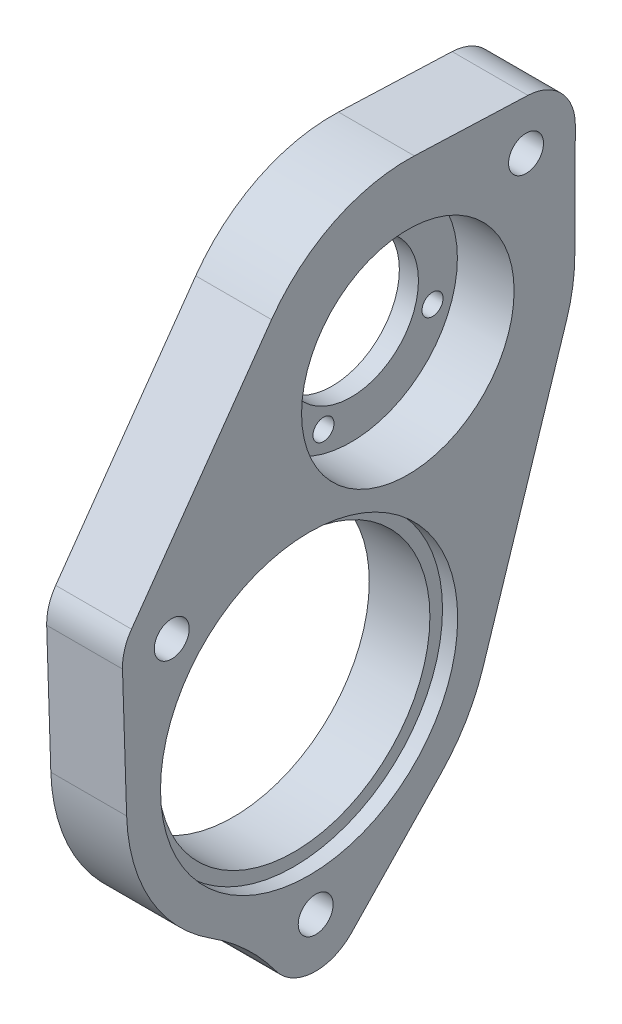
ISO-10303-21;
HEADER;
FILE_DESCRIPTION(('STEP AP214'),'2;1');
FILE_NAME('part.step','',(''),(''),'','','');
FILE_SCHEMA(('AUTOMOTIVE_DESIGN { 1 0 10303 214 1 1 1 1 }'));
ENDSEC;
DATA;
#1=APPLICATION_CONTEXT('core data for automotive mechanical design processes');
#2=APPLICATION_PROTOCOL_DEFINITION('international standard','automotive_design',2000,#1);
#3=PRODUCT_CONTEXT('',#1,'mechanical');
#4=PRODUCT('Part','Part','',(#3));
#5=PRODUCT_RELATED_PRODUCT_CATEGORY('part','',(#4));
#6=PRODUCT_DEFINITION_FORMATION('','',#4);
#7=PRODUCT_DEFINITION_CONTEXT('part definition',#1,'design');
#8=PRODUCT_DEFINITION('design','',#6,#7);
#9=PRODUCT_DEFINITION_SHAPE('','',#8);
#10=(LENGTH_UNIT() NAMED_UNIT(*) SI_UNIT(.MILLI.,.METRE.));
#11=(NAMED_UNIT(*) PLANE_ANGLE_UNIT() SI_UNIT($,.RADIAN.));
#12=(NAMED_UNIT(*) SI_UNIT($,.STERADIAN.) SOLID_ANGLE_UNIT());
#13=UNCERTAINTY_MEASURE_WITH_UNIT(LENGTH_MEASURE(1.E-05),#10,'distance_accuracy_value','');
#14=(GEOMETRIC_REPRESENTATION_CONTEXT(3) GLOBAL_UNCERTAINTY_ASSIGNED_CONTEXT((#13)) GLOBAL_UNIT_ASSIGNED_CONTEXT((#10,
#11,#12)) REPRESENTATION_CONTEXT('',''));
#15=CARTESIAN_POINT('',(0.,0.,0.));
#16=DIRECTION('',(0.,0.,1.));
#17=DIRECTION('',(1.,0.,0.));
#18=AXIS2_PLACEMENT_3D('',#15,#16,#17);
#19=CARTESIAN_POINT('',(-55.5625,36.576,-137.31419272294));
#20=DIRECTION('',(1.,0.,0.));
#21=DIRECTION('',(0.,0.,-1.));
#22=AXIS2_PLACEMENT_3D('',#19,#20,#21);
#23=CYLINDRICAL_SURFACE('',#22,14.2367);
#24=CARTESIAN_POINT('',(-55.5625,36.576,-137.31419272294));
#25=DIRECTION('',(-1.,0.,0.));
#26=DIRECTION('',(0.,0.,1.));
#27=AXIS2_PLACEMENT_3D('',#24,#25,#26);
#28=CIRCLE('',#27,14.2367);
#29=CARTESIAN_POINT('',(-55.5625,36.576,-123.07749272294));
#30=VERTEX_POINT('',#29);
#31=EDGE_CURVE('E207',#30,#30,#28,.T.);
#32=ORIENTED_EDGE('',*,*,#31,.T.);
#33=EDGE_LOOP('',(#32));
#34=FACE_BOUND('',#33,.T.);
#35=CARTESIAN_POINT('',(-49.2125,36.576,-137.31419272294));
#36=DIRECTION('',(1.,0.,0.));
#37=DIRECTION('',(0.,0.,-1.));
#38=AXIS2_PLACEMENT_3D('',#35,#36,#37);
#39=CIRCLE('',#38,14.2367);
#40=CARTESIAN_POINT('',(-49.2125,36.576,-151.55089272294));
#41=VERTEX_POINT('',#40);
#42=EDGE_CURVE('E48',#41,#41,#39,.T.);
#43=ORIENTED_EDGE('',*,*,#42,.T.);
#44=EDGE_LOOP('',(#43));
#45=FACE_BOUND('',#44,.T.);
#46=ADVANCED_FACE('F44',(#34,#45),#23,.F.);
#47=CARTESIAN_POINT('',(-55.5625,71.8176490521173,-150.54405970577));
#48=DIRECTION('',(1.,0.,0.));
#49=DIRECTION('',(0.,0.,-1.));
#50=AXIS2_PLACEMENT_3D('',#47,#48,#49);
#51=CYLINDRICAL_SURFACE('',#50,1.09999999999999);
#52=CARTESIAN_POINT('',(-55.5625,71.8176490521173,-150.54405970577));
#53=DIRECTION('',(-1.,0.,0.));
#54=DIRECTION('',(0.,0.,1.));
#55=AXIS2_PLACEMENT_3D('',#52,#53,#54);
#56=CIRCLE('',#55,1.09999999999999);
#57=CARTESIAN_POINT('',(-55.5625,71.8176490521173,-149.44405970577));
#58=VERTEX_POINT('',#57);
#59=EDGE_CURVE('E216',#58,#58,#56,.T.);
#60=ORIENTED_EDGE('',*,*,#59,.T.);
#61=EDGE_LOOP('',(#60));
#62=FACE_BOUND('',#61,.T.);
#63=CARTESIAN_POINT('',(-53.5625,71.8176490521173,-150.54405970577));
#64=DIRECTION('',(1.,0.,0.));
#65=DIRECTION('',(0.,0.,-1.));
#66=AXIS2_PLACEMENT_3D('',#63,#64,#65);
#67=CIRCLE('',#66,1.09999999999999);
#68=CARTESIAN_POINT('',(-53.5625,71.8176490521173,-151.64405970577));
#69=VERTEX_POINT('',#68);
#70=EDGE_CURVE('E180',#69,#69,#67,.T.);
#71=ORIENTED_EDGE('',*,*,#70,.T.);
#72=EDGE_LOOP('',(#71));
#73=FACE_BOUND('',#72,.T.);
#74=ADVANCED_FACE('F334',(#62,#73),#51,.F.);
#75=CARTESIAN_POINT('',(-55.5625,60.4028635691856,-156.174572327072));
#76=DIRECTION('',(1.,0.,0.));
#77=DIRECTION('',(0.,0.,-1.));
#78=AXIS2_PLACEMENT_3D('',#75,#76,#77);
#79=CYLINDRICAL_SURFACE('',#78,1.09999999999999);
#80=CARTESIAN_POINT('',(-55.5625,60.4028635691856,-156.174572327072));
#81=DIRECTION('',(-1.,0.,0.));
#82=DIRECTION('',(0.,0.,1.));
#83=AXIS2_PLACEMENT_3D('',#80,#81,#82);
#84=CIRCLE('',#83,1.09999999999999);
#85=CARTESIAN_POINT('',(-55.5625,60.4028635691856,-155.074572327072));
#86=VERTEX_POINT('',#85);
#87=EDGE_CURVE('E213',#86,#86,#84,.T.);
#88=ORIENTED_EDGE('',*,*,#87,.T.);
#89=EDGE_LOOP('',(#88));
#90=FACE_BOUND('',#89,.T.);
#91=CARTESIAN_POINT('',(-53.5625,60.4028635691856,-156.174572327072));
#92=DIRECTION('',(1.,0.,0.));
#93=DIRECTION('',(0.,0.,-1.));
#94=AXIS2_PLACEMENT_3D('',#91,#92,#93);
#95=CIRCLE('',#94,1.09999999999999);
#96=CARTESIAN_POINT('',(-53.5625,60.4028635691856,-157.274572327072));
#97=VERTEX_POINT('',#96);
#98=EDGE_CURVE('E327',#97,#97,#95,.T.);
#99=ORIENTED_EDGE('',*,*,#98,.T.);
#100=EDGE_LOOP('',(#99));
#101=FACE_BOUND('',#100,.T.);
#102=ADVANCED_FACE('F404',(#90,#101),#79,.F.);
#103=CARTESIAN_POINT('',(-55.5625,66.1871364308144,-139.129274222838));
#104=DIRECTION('',(1.,0.,0.));
#105=DIRECTION('',(0.,0.,-1.));
#106=AXIS2_PLACEMENT_3D('',#103,#104,#105);
#107=CYLINDRICAL_SURFACE('',#106,1.09999999999999);
#108=CARTESIAN_POINT('',(-55.5625,66.1871364308144,-139.129274222838));
#109=DIRECTION('',(-1.,0.,0.));
#110=DIRECTION('',(0.,0.,1.));
#111=AXIS2_PLACEMENT_3D('',#108,#109,#110);
#112=CIRCLE('',#111,1.09999999999999);
#113=CARTESIAN_POINT('',(-55.5625,66.1871364308144,-138.029274222838));
#114=VERTEX_POINT('',#113);
#115=EDGE_CURVE('E210',#114,#114,#112,.T.);
#116=ORIENTED_EDGE('',*,*,#115,.T.);
#117=EDGE_LOOP('',(#116));
#118=FACE_BOUND('',#117,.T.);
#119=CARTESIAN_POINT('',(-53.5625,66.1871364308144,-139.129274222838));
#120=DIRECTION('',(1.,0.,0.));
#121=DIRECTION('',(0.,0.,-1.));
#122=AXIS2_PLACEMENT_3D('',#119,#120,#121);
#123=CIRCLE('',#122,1.09999999999999);
#124=CARTESIAN_POINT('',(-53.5625,66.1871364308144,-140.229274222838));
#125=VERTEX_POINT('',#124);
#126=EDGE_CURVE('E325',#125,#125,#123,.T.);
#127=ORIENTED_EDGE('',*,*,#126,.T.);
#128=EDGE_LOOP('',(#127));
#129=FACE_BOUND('',#128,.T.);
#130=ADVANCED_FACE('F410',(#118,#129),#107,.F.);
#131=CARTESIAN_POINT('',(-55.5625,54.7723509478827,-144.759786844141));
#132=DIRECTION('',(1.,0.,0.));
#133=DIRECTION('',(0.,0.,-1.));
#134=AXIS2_PLACEMENT_3D('',#131,#132,#133);
#135=CYLINDRICAL_SURFACE('',#134,1.09999999999999);
#136=CARTESIAN_POINT('',(-55.5625,54.7723509478827,-144.759786844141));
#137=DIRECTION('',(-1.,0.,0.));
#138=DIRECTION('',(0.,0.,1.));
#139=AXIS2_PLACEMENT_3D('',#136,#137,#138);
#140=CIRCLE('',#139,1.09999999999999);
#141=CARTESIAN_POINT('',(-55.5625,54.7723509478827,-143.659786844141));
#142=VERTEX_POINT('',#141);
#143=EDGE_CURVE('E204',#142,#142,#140,.T.);
#144=ORIENTED_EDGE('',*,*,#143,.T.);
#145=EDGE_LOOP('',(#144));
#146=FACE_BOUND('',#145,.T.);
#147=CARTESIAN_POINT('',(-53.5625,54.7723509478827,-144.759786844141));
#148=DIRECTION('',(1.,0.,0.));
#149=DIRECTION('',(0.,0.,-1.));
#150=AXIS2_PLACEMENT_3D('',#147,#148,#149);
#151=CIRCLE('',#150,1.09999999999999);
#152=CARTESIAN_POINT('',(-53.5625,54.7723509478827,-145.859786844141));
#153=VERTEX_POINT('',#152);
#154=EDGE_CURVE('E278',#153,#153,#151,.T.);
#155=ORIENTED_EDGE('',*,*,#154,.T.);
#156=EDGE_LOOP('',(#155));
#157=FACE_BOUND('',#156,.T.);
#158=ADVANCED_FACE('F412',(#146,#157),#135,.F.);
#159=CARTESIAN_POINT('',(-55.5625,63.295,-147.651923274955));
#160=DIRECTION('',(1.,0.,0.));
#161=DIRECTION('',(0.,0.,-1.));
#162=AXIS2_PLACEMENT_3D('',#159,#160,#161);
#163=CYLINDRICAL_SURFACE('',#162,7.05000000000001);
#164=CARTESIAN_POINT('',(-55.5625,63.295,-147.651923274955));
#165=DIRECTION('',(-1.,0.,0.));
#166=DIRECTION('',(0.,0.,1.));
#167=AXIS2_PLACEMENT_3D('',#164,#165,#166);
#168=CIRCLE('',#167,7.05000000000001);
#169=CARTESIAN_POINT('',(-55.5625,63.295,-140.601923274955));
#170=VERTEX_POINT('',#169);
#171=EDGE_CURVE('E219',#170,#170,#168,.T.);
#172=ORIENTED_EDGE('',*,*,#171,.T.);
#173=EDGE_LOOP('',(#172));
#174=FACE_BOUND('',#173,.T.);
#175=CARTESIAN_POINT('',(-53.5625,63.295,-147.651923274955));
#176=DIRECTION('',(1.,0.,0.));
#177=DIRECTION('',(0.,0.,-1.));
#178=AXIS2_PLACEMENT_3D('',#175,#176,#177);
#179=CIRCLE('',#178,7.05000000000001);
#180=CARTESIAN_POINT('',(-53.5625,63.295,-154.701923274955));
#181=VERTEX_POINT('',#180);
#182=EDGE_CURVE('E275',#181,#181,#179,.T.);
#183=ORIENTED_EDGE('',*,*,#182,.T.);
#184=EDGE_LOOP('',(#183));
#185=FACE_BOUND('',#184,.T.);
#186=ADVANCED_FACE('F415',(#174,#185),#163,.F.);
#187=CARTESIAN_POINT('',(-55.5625,86.401817609715,-3.36327832071318));
#188=DIRECTION('',(0.,0.99924324262576,-0.0388965559755132));
#189=DIRECTION('',(0.,0.0388965559755132,0.99924324262576));
#190=AXIS2_PLACEMENT_3D('',#187,#188,#189);
#191=PLANE('',#190);
#192=DIRECTION('',(0.,0.0388965559755132,0.99924324262576));
#193=VECTOR('',#192,1.);
#194=CARTESIAN_POINT('',(-47.625,86.401817609715,-3.36327832071318));
#195=LINE('',#194,#193);
#196=CARTESIAN_POINT('',(-47.625,80.2956551243813,-160.229135690856));
#197=VERTEX_POINT('',#196);
#198=CARTESIAN_POINT('',(-47.625,80.7587741513704,-148.331718383739));
#199=VERTEX_POINT('',#198);
#200=EDGE_CURVE('E153',#197,#199,#195,.T.);
#201=ORIENTED_EDGE('',*,*,#200,.F.);
#202=DIRECTION('',(1.,0.,0.));
#203=VECTOR('',#202,1.);
#204=CARTESIAN_POINT('',(-55.5625,80.2956551243813,-160.229135690856));
#205=LINE('',#204,#203);
#206=CARTESIAN_POINT('',(-55.5625,80.2956551243813,-160.229135690856));
#207=VERTEX_POINT('',#206);
#208=EDGE_CURVE('E147',#207,#197,#205,.T.);
#209=ORIENTED_EDGE('',*,*,#208,.F.);
#210=DIRECTION('',(0.,0.0388965559755132,0.99924324262576));
#211=VECTOR('',#210,1.);
#212=CARTESIAN_POINT('',(-55.5625,86.401817609715,-3.36327832071318));
#213=LINE('',#212,#211);
#214=CARTESIAN_POINT('',(-55.5625,80.7587741513704,-148.331718383739));
#215=VERTEX_POINT('',#214);
#216=EDGE_CURVE('E151',#207,#215,#213,.T.);
#217=ORIENTED_EDGE('',*,*,#216,.T.);
#218=DIRECTION('',(1.,0.,0.));
#219=VECTOR('',#218,1.);
#220=CARTESIAN_POINT('',(-55.5625,80.7587741513704,-148.331718383739));
#221=LINE('',#220,#219);
#222=EDGE_CURVE('E222',#215,#199,#221,.T.);
#223=ORIENTED_EDGE('',*,*,#222,.T.);
#224=EDGE_LOOP('',(#201,#209,#217,#223));
#225=FACE_BOUND('',#224,.T.);
#226=ADVANCED_FACE('F149',(#225),#191,.T.);
#227=CARTESIAN_POINT('',(-55.5625,75.1395499999999,-160.028429073056));
#228=DIRECTION('',(1.,0.,0.));
#229=DIRECTION('',(0.,0.,-1.));
#230=AXIS2_PLACEMENT_3D('',#227,#228,#229);
#231=CYLINDRICAL_SURFACE('',#230,5.16000999999998);
#232=CARTESIAN_POINT('',(-47.625,75.1395499999999,-160.028429073056));
#233=DIRECTION('',(-1.,0.,0.));
#234=DIRECTION('',(0.,0.,1.));
#235=AXIS2_PLACEMENT_3D('',#232,#233,#234);
#236=CIRCLE('',#235,5.16000999999998);
#237=CARTESIAN_POINT('',(-47.625,75.1136899962217,-165.188374272407));
#238=VERTEX_POINT('',#237);
#239=EDGE_CURVE('E224',#197,#238,#236,.T.);
#240=ORIENTED_EDGE('',*,*,#239,.T.);
#241=DIRECTION('',(1.,0.,0.));
#242=VECTOR('',#241,1.);
#243=CARTESIAN_POINT('',(-55.5625,75.1136899962217,-165.188374272407));
#244=LINE('',#243,#242);
#245=CARTESIAN_POINT('',(-55.5625,75.1136899962217,-165.188374272407));
#246=VERTEX_POINT('',#245);
#247=EDGE_CURVE('E157',#246,#238,#244,.T.);
#248=ORIENTED_EDGE('',*,*,#247,.F.);
#249=CARTESIAN_POINT('',(-55.5625,75.1395499999999,-160.028429073056));
#250=DIRECTION('',(-1.,0.,0.));
#251=DIRECTION('',(0.,0.,1.));
#252=AXIS2_PLACEMENT_3D('',#249,#250,#251);
#253=CIRCLE('',#252,5.16000999999998);
#254=EDGE_CURVE('E160',#207,#246,#253,.T.);
#255=ORIENTED_EDGE('',*,*,#254,.F.);
#256=ORIENTED_EDGE('',*,*,#208,.T.);
#257=EDGE_LOOP('',(#240,#248,#255,#256));
#258=FACE_BOUND('',#257,.T.);
#259=ADVANCED_FACE('F161',(#258),#231,.T.);
#260=CARTESIAN_POINT('',(-55.5625,-0.825964206707811,-164.80778888463));
#261=DIRECTION('',(0.,0.00501161892675137,0.999987441759012));
#262=DIRECTION('',(0.,-0.999987441759012,0.00501161892675137));
#263=AXIS2_PLACEMENT_3D('',#260,#261,#262);
#264=PLANE('',#263);
#265=DIRECTION('',(0.,-0.999987441759012,0.00501161892675137));
#266=VECTOR('',#265,1.);
#267=CARTESIAN_POINT('',(-47.625,-0.825964206707811,-164.80778888463));
#268=LINE('',#267,#266);
#269=CARTESIAN_POINT('',(-47.625,63.2074119360171,-165.128703794577));
#270=VERTEX_POINT('',#269);
#271=EDGE_CURVE('E226',#238,#270,#268,.T.);
#272=ORIENTED_EDGE('',*,*,#271,.T.);
#273=DIRECTION('',(1.,0.,0.));
#274=VECTOR('',#273,1.);
#275=CARTESIAN_POINT('',(-55.5625,63.2074119360171,-165.128703794577));
#276=LINE('',#275,#274);
#277=CARTESIAN_POINT('',(-55.5625,63.2074119360171,-165.128703794577));
#278=VERTEX_POINT('',#277);
#279=EDGE_CURVE('E267',#278,#270,#276,.T.);
#280=ORIENTED_EDGE('',*,*,#279,.F.);
#281=DIRECTION('',(0.,-0.999987441759012,0.00501161892675137));
#282=VECTOR('',#281,1.);
#283=CARTESIAN_POINT('',(-55.5625,-0.825964206707811,-164.80778888463));
#284=LINE('',#283,#282);
#285=EDGE_CURVE('E165',#246,#278,#284,.T.);
#286=ORIENTED_EDGE('',*,*,#285,.F.);
#287=ORIENTED_EDGE('',*,*,#247,.T.);
#288=EDGE_LOOP('',(#272,#280,#286,#287));
#289=FACE_BOUND('',#288,.T.);
#290=ADVANCED_FACE('F365',(#289),#264,.F.);
#291=CARTESIAN_POINT('',(-55.5625,63.295,-147.651923274955));
#292=DIRECTION('',(1.,0.,0.));
#293=DIRECTION('',(0.,0.,-1.));
#294=AXIS2_PLACEMENT_3D('',#291,#292,#293);
#295=CYLINDRICAL_SURFACE('',#294,17.477);
#296=CARTESIAN_POINT('',(-47.625,63.295,-147.651923274955));
#297=DIRECTION('',(-1.,0.,0.));
#298=DIRECTION('',(0.,0.,1.));
#299=AXIS2_PLACEMENT_3D('',#296,#297,#298);
#300=CIRCLE('',#299,17.477);
#301=CARTESIAN_POINT('',(-47.625,57.9299776505254,-164.285084856255));
#302=VERTEX_POINT('',#301);
#303=EDGE_CURVE('E178',#270,#302,#300,.T.);
#304=ORIENTED_EDGE('',*,*,#303,.T.);
#305=DIRECTION('',(1.,0.,0.));
#306=VECTOR('',#305,1.);
#307=CARTESIAN_POINT('',(-55.5625,57.9299776505254,-164.285084856255));
#308=LINE('',#307,#306);
#309=CARTESIAN_POINT('',(-55.5625,57.9299776505254,-164.285084856255));
#310=VERTEX_POINT('',#309);
#311=EDGE_CURVE('E265',#310,#302,#308,.T.);
#312=ORIENTED_EDGE('',*,*,#311,.F.);
#313=CARTESIAN_POINT('',(-55.5625,63.295,-147.651923274955));
#314=DIRECTION('',(-1.,0.,0.));
#315=DIRECTION('',(0.,0.,1.));
#316=AXIS2_PLACEMENT_3D('',#313,#314,#315);
#317=CIRCLE('',#316,17.477);
#318=EDGE_CURVE('E184',#278,#310,#317,.T.);
#319=ORIENTED_EDGE('',*,*,#318,.F.);
#320=ORIENTED_EDGE('',*,*,#279,.T.);
#321=EDGE_LOOP('',(#304,#312,#319,#320));
#322=FACE_BOUND('',#321,.T.);
#323=ADVANCED_FACE('F371',(#322),#295,.T.);
#324=CARTESIAN_POINT('',(-55.5625,-42.5376311194463,-131.879281316467));
#325=DIRECTION('',(0.,-0.306976160066063,-0.951717204400075));
#326=DIRECTION('',(0.,0.951717204400075,-0.306976160066063));
#327=AXIS2_PLACEMENT_3D('',#324,#325,#326);
#328=PLANE('',#327);
#329=DIRECTION('',(0.,0.951717204400075,-0.306976160066063));
#330=VECTOR('',#329,1.);
#331=CARTESIAN_POINT('',(-47.625,-42.5376311194463,-131.879281316467));
#332=LINE('',#331,#330);
#333=CARTESIAN_POINT('',(-47.625,30.7086111645773,-155.504839509241));
#334=VERTEX_POINT('',#333);
#335=EDGE_CURVE('E229',#334,#302,#332,.T.);
#336=ORIENTED_EDGE('',*,*,#335,.F.);
#337=DIRECTION('',(1.,0.,0.));
#338=VECTOR('',#337,1.);
#339=CARTESIAN_POINT('',(-55.5625,30.7086111645773,-155.504839509241));
#340=LINE('',#339,#338);
#341=CARTESIAN_POINT('',(-55.5625,30.7086111645773,-155.504839509241));
#342=VERTEX_POINT('',#341);
#343=EDGE_CURVE('E263',#342,#334,#340,.T.);
#344=ORIENTED_EDGE('',*,*,#343,.F.);
#345=DIRECTION('',(0.,0.951717204400075,-0.306976160066063));
#346=VECTOR('',#345,1.);
#347=CARTESIAN_POINT('',(-55.5625,-42.5376311194463,-131.879281316467));
#348=LINE('',#347,#346);
#349=EDGE_CURVE('E186',#342,#310,#348,.T.);
#350=ORIENTED_EDGE('',*,*,#349,.T.);
#351=ORIENTED_EDGE('',*,*,#311,.T.);
#352=EDGE_LOOP('',(#336,#344,#350,#351));
#353=FACE_BOUND('',#352,.T.);
#354=ADVANCED_FACE('F374',(#353),#328,.T.);
#355=CARTESIAN_POINT('',(-55.5625,36.576,-137.31419272294));
#356=DIRECTION('',(1.,0.,0.));
#357=DIRECTION('',(0.,0.,-1.));
#358=AXIS2_PLACEMENT_3D('',#355,#356,#357);
#359=CYLINDRICAL_SURFACE('',#358,19.1135);
#360=CARTESIAN_POINT('',(-47.625,36.576,-137.31419272294));
#361=DIRECTION('',(-1.,0.,0.));
#362=DIRECTION('',(0.,0.,1.));
#363=AXIS2_PLACEMENT_3D('',#360,#361,#362);
#364=CIRCLE('',#363,19.1135);
#365=CARTESIAN_POINT('',(-47.625,23.343004735663,-151.105991684063));
#366=VERTEX_POINT('',#365);
#367=EDGE_CURVE('E232',#334,#366,#364,.T.);
#368=ORIENTED_EDGE('',*,*,#367,.T.);
#369=DIRECTION('',(1.,0.,0.));
#370=VECTOR('',#369,1.);
#371=CARTESIAN_POINT('',(-55.5625,23.343004735663,-151.105991684063));
#372=LINE('',#371,#370);
#373=CARTESIAN_POINT('',(-55.5625,23.343004735663,-151.105991684063));
#374=VERTEX_POINT('',#373);
#375=EDGE_CURVE('E260',#374,#366,#372,.T.);
#376=ORIENTED_EDGE('',*,*,#375,.F.);
#377=CARTESIAN_POINT('',(-55.5625,36.576,-137.31419272294));
#378=DIRECTION('',(-1.,0.,0.));
#379=DIRECTION('',(0.,0.,1.));
#380=AXIS2_PLACEMENT_3D('',#377,#378,#379);
#381=CIRCLE('',#380,19.1135);
#382=EDGE_CURVE('E189',#342,#374,#381,.T.);
#383=ORIENTED_EDGE('',*,*,#382,.F.);
#384=ORIENTED_EDGE('',*,*,#343,.T.);
#385=EDGE_LOOP('',(#368,#376,#383,#384));
#386=FACE_BOUND('',#385,.T.);
#387=ADVANCED_FACE('F379',(#386),#359,.T.);
#388=CARTESIAN_POINT('',(-55.5625,-64.2993821160548,-67.0146201789256));
#389=DIRECTION('',(0.,0.692337628604753,0.721573702415732));
#390=DIRECTION('',(0.,-0.721573702415732,0.692337628604753));
#391=AXIS2_PLACEMENT_3D('',#388,#389,#390);
#392=PLANE('',#391);
#393=DIRECTION('',(0.,-0.721573702415732,0.692337628604753));
#394=VECTOR('',#393,1.);
#395=CARTESIAN_POINT('',(-47.625,-64.2993821160548,-67.0146201789256));
#396=LINE('',#395,#394);
#397=CARTESIAN_POINT('',(-47.625,13.568257185254,-141.72728855699));
#398=VERTEX_POINT('',#397);
#399=EDGE_CURVE('E234',#366,#398,#396,.T.);
#400=ORIENTED_EDGE('',*,*,#399,.T.);
#401=DIRECTION('',(1.,0.,0.));
#402=VECTOR('',#401,1.);
#403=CARTESIAN_POINT('',(-55.5625,13.568257185254,-141.72728855699));
#404=LINE('',#403,#402);
#405=CARTESIAN_POINT('',(-55.5625,13.568257185254,-141.72728855699));
#406=VERTEX_POINT('',#405);
#407=EDGE_CURVE('E257',#406,#398,#404,.T.);
#408=ORIENTED_EDGE('',*,*,#407,.F.);
#409=DIRECTION('',(0.,-0.721573702415732,0.692337628604753));
#410=VECTOR('',#409,1.);
#411=CARTESIAN_POINT('',(-55.5625,-64.2993821160548,-67.0146201789256));
#412=LINE('',#411,#410);
#413=EDGE_CURVE('E191',#374,#406,#412,.T.);
#414=ORIENTED_EDGE('',*,*,#413,.F.);
#415=ORIENTED_EDGE('',*,*,#375,.T.);
#416=EDGE_LOOP('',(#400,#408,#414,#415));
#417=FACE_BOUND('',#416,.T.);
#418=ADVANCED_FACE('F384',(#417),#392,.F.);
#419=CARTESIAN_POINT('',(-55.5625,17.1407262722309,-138.003961036787));
#420=DIRECTION('',(1.,0.,0.));
#421=DIRECTION('',(0.,0.,-1.));
#422=AXIS2_PLACEMENT_3D('',#419,#420,#421);
#423=CYLINDRICAL_SURFACE('',#422,5.16000999999998);
#424=CARTESIAN_POINT('',(-47.625,17.1407262722309,-138.003961036787));
#425=DIRECTION('',(-1.,0.,0.));
#426=DIRECTION('',(0.,0.,1.));
#427=AXIS2_PLACEMENT_3D('',#424,#425,#426);
#428=CIRCLE('',#427,5.16000999999998);
#429=CARTESIAN_POINT('',(-47.625,14.0856550345682,-133.845566763404));
#430=VERTEX_POINT('',#429);
#431=EDGE_CURVE('E237',#398,#430,#428,.T.);
#432=ORIENTED_EDGE('',*,*,#431,.T.);
#433=DIRECTION('',(1.,0.,0.));
#434=VECTOR('',#433,1.);
#435=CARTESIAN_POINT('',(-55.5625,14.0856550345682,-133.845566763404));
#436=LINE('',#435,#434);
#437=CARTESIAN_POINT('',(-55.5625,14.0856550345682,-133.845566763404));
#438=VERTEX_POINT('',#437);
#439=EDGE_CURVE('E61',#430,#438,#436,.F.);
#440=ORIENTED_EDGE('',*,*,#439,.T.);
#441=CARTESIAN_POINT('',(-55.5625,17.1407262722309,-138.003961036787));
#442=DIRECTION('',(-1.,0.,0.));
#443=DIRECTION('',(0.,0.,1.));
#444=AXIS2_PLACEMENT_3D('',#441,#442,#443);
#445=CIRCLE('',#444,5.16000999999998);
#446=EDGE_CURVE('E194',#406,#438,#445,.T.);
#447=ORIENTED_EDGE('',*,*,#446,.F.);
#448=ORIENTED_EDGE('',*,*,#407,.T.);
#449=EDGE_LOOP('',(#432,#440,#447,#448));
#450=FACE_BOUND('',#449,.T.);
#451=ADVANCED_FACE('F386',(#450),#423,.T.);
#452=CARTESIAN_POINT('',(-55.5625,20.4616172906224,-127.03544999118));
#453=VERTEX_POINT('',#452);
#454=CARTESIAN_POINT('',(-55.5625,35.9631911724945,-118.210519055529));
#455=VERTEX_POINT('',#454);
#456=EDGE_CURVE('E192',#453,#455,#381,.T.);
#457=ORIENTED_EDGE('',*,*,#456,.F.);
#458=DIRECTION('',(1.,0.,0.));
#459=VECTOR('',#458,1.);
#460=CARTESIAN_POINT('',(-55.5625,20.4616172906224,-127.03544999118));
#461=LINE('',#460,#459);
#462=CARTESIAN_POINT('',(-47.625,20.4616172906224,-127.03544999118));
#463=VERTEX_POINT('',#462);
#464=EDGE_CURVE('E156',#453,#463,#461,.T.);
#465=ORIENTED_EDGE('',*,*,#464,.T.);
#466=CARTESIAN_POINT('',(-47.625,35.9631911724945,-118.210519055529));
#467=VERTEX_POINT('',#466);
#468=EDGE_CURVE('E235',#463,#467,#364,.T.);
#469=ORIENTED_EDGE('',*,*,#468,.T.);
#470=DIRECTION('',(1.,0.,0.));
#471=VECTOR('',#470,1.);
#472=CARTESIAN_POINT('',(-55.5625,35.9631911724945,-118.210519055529));
#473=LINE('',#472,#471);
#474=EDGE_CURVE('E254',#455,#467,#473,.T.);
#475=ORIENTED_EDGE('',*,*,#474,.F.);
#476=EDGE_LOOP('',(#457,#465,#469,#475));
#477=FACE_BOUND('',#476,.T.);
#478=ADVANCED_FACE('F388',(#477),#359,.T.);
#479=CARTESIAN_POINT('',(-55.5625,3.82503458350725,-119.241448833768));
#480=DIRECTION('',(0.,-0.0320615704871189,0.999485895697333));
#481=DIRECTION('',(0.,-0.999485895697333,-0.0320615704871189));
#482=AXIS2_PLACEMENT_3D('',#479,#480,#481);
#483=PLANE('',#482);
#484=DIRECTION('',(0.,-0.999485895697333,-0.0320615704871189));
#485=VECTOR('',#484,1.);
#486=CARTESIAN_POINT('',(-47.625,3.82503458350725,-119.241448833768));
#487=LINE('',#486,#485);
#488=CARTESIAN_POINT('',(-47.625,49.50265675713,-117.776199239643));
#489=VERTEX_POINT('',#488);
#490=EDGE_CURVE('E239',#489,#467,#487,.T.);
#491=ORIENTED_EDGE('',*,*,#490,.F.);
#492=DIRECTION('',(1.,0.,0.));
#493=VECTOR('',#492,1.);
#494=CARTESIAN_POINT('',(-55.5625,49.50265675713,-117.776199239643));
#495=LINE('',#494,#493);
#496=CARTESIAN_POINT('',(-55.5625,49.50265675713,-117.776199239643));
#497=VERTEX_POINT('',#496);
#498=EDGE_CURVE('E252',#497,#489,#495,.T.);
#499=ORIENTED_EDGE('',*,*,#498,.F.);
#500=DIRECTION('',(0.,-0.999485895697333,-0.0320615704871189));
#501=VECTOR('',#500,1.);
#502=CARTESIAN_POINT('',(-55.5625,3.82503458350725,-119.241448833768));
#503=LINE('',#502,#501);
#504=EDGE_CURVE('E196',#497,#455,#503,.T.);
#505=ORIENTED_EDGE('',*,*,#504,.T.);
#506=ORIENTED_EDGE('',*,*,#474,.T.);
#507=EDGE_LOOP('',(#491,#499,#505,#506));
#508=FACE_BOUND('',#507,.T.);
#509=ADVANCED_FACE('F394',(#508),#483,.T.);
#510=CARTESIAN_POINT('',(-55.5625,49.6680947814592,-122.9335564563));
#511=DIRECTION('',(1.,0.,0.));
#512=DIRECTION('',(0.,0.,-1.));
#513=AXIS2_PLACEMENT_3D('',#510,#511,#512);
#514=CYLINDRICAL_SURFACE('',#513,5.16000999999998);
#515=CARTESIAN_POINT('',(-47.625,49.6680947814592,-122.9335564563));
#516=DIRECTION('',(-1.,0.,0.));
#517=DIRECTION('',(0.,0.,1.));
#518=AXIS2_PLACEMENT_3D('',#515,#516,#517);
#519=CIRCLE('',#518,5.16000999999998);
#520=CARTESIAN_POINT('',(-47.625,52.6468919385174,-118.720188362103));
#521=VERTEX_POINT('',#520);
#522=EDGE_CURVE('E242',#489,#521,#519,.T.);
#523=ORIENTED_EDGE('',*,*,#522,.T.);
#524=DIRECTION('',(1.,0.,0.));
#525=VECTOR('',#524,1.);
#526=CARTESIAN_POINT('',(-55.5625,52.6468919385174,-118.720188362103));
#527=LINE('',#526,#525);
#528=CARTESIAN_POINT('',(-55.5625,52.6468919385174,-118.720188362103));
#529=VERTEX_POINT('',#528);
#530=EDGE_CURVE('E250',#529,#521,#527,.T.);
#531=ORIENTED_EDGE('',*,*,#530,.F.);
#532=CARTESIAN_POINT('',(-55.5625,49.6680947814592,-122.9335564563));
#533=DIRECTION('',(-1.,0.,0.));
#534=DIRECTION('',(0.,0.,1.));
#535=AXIS2_PLACEMENT_3D('',#532,#533,#534);
#536=CIRCLE('',#535,5.16000999999998);
#537=EDGE_CURVE('E199',#497,#529,#536,.T.);
#538=ORIENTED_EDGE('',*,*,#537,.F.);
#539=ORIENTED_EDGE('',*,*,#498,.T.);
#540=EDGE_LOOP('',(#523,#531,#538,#539));
#541=FACE_BOUND('',#540,.T.);
#542=ADVANCED_FACE('F424',(#541),#514,.T.);
#543=CARTESIAN_POINT('',(-55.5625,-38.4170711871903,-54.3391353886196));
#544=DIRECTION('',(0.,0.577285151978047,0.816542621854906));
#545=DIRECTION('',(0.,-0.816542621854906,0.577285151978047));
#546=AXIS2_PLACEMENT_3D('',#543,#544,#545);
#547=PLANE('',#546);
#548=DIRECTION('',(0.,-0.816542621854906,0.577285151978047));
#549=VECTOR('',#548,1.);
#550=CARTESIAN_POINT('',(-47.625,-38.4170711871903,-54.3391353886196));
#551=LINE('',#550,#549);
#552=CARTESIAN_POINT('',(-47.625,73.3842126011203,-133.381207872797));
#553=VERTEX_POINT('',#552);
#554=EDGE_CURVE('E176',#553,#521,#551,.T.);
#555=ORIENTED_EDGE('',*,*,#554,.F.);
#556=DIRECTION('',(1.,0.,0.));
#557=VECTOR('',#556,1.);
#558=CARTESIAN_POINT('',(-55.5625,73.3842126011203,-133.381207872797));
#559=LINE('',#558,#557);
#560=CARTESIAN_POINT('',(-55.5625,73.3842126011203,-133.381207872797));
#561=VERTEX_POINT('',#560);
#562=EDGE_CURVE('E248',#561,#553,#559,.T.);
#563=ORIENTED_EDGE('',*,*,#562,.F.);
#564=DIRECTION('',(0.,-0.816542621854906,0.577285151978047));
#565=VECTOR('',#564,1.);
#566=CARTESIAN_POINT('',(-55.5625,-38.4170711871903,-54.3391353886196));
#567=LINE('',#566,#565);
#568=EDGE_CURVE('E201',#561,#529,#567,.T.);
#569=ORIENTED_EDGE('',*,*,#568,.T.);
#570=ORIENTED_EDGE('',*,*,#530,.T.);
#571=EDGE_LOOP('',(#555,#563,#569,#570));
#572=FACE_BOUND('',#571,.T.);
#573=ADVANCED_FACE('F420',(#572),#547,.T.);
#574=EDGE_CURVE('E173',#553,#199,#300,.T.);
#575=ORIENTED_EDGE('',*,*,#574,.T.);
#576=ORIENTED_EDGE('',*,*,#222,.F.);
#577=EDGE_CURVE('E171',#561,#215,#317,.T.);
#578=ORIENTED_EDGE('',*,*,#577,.F.);
#579=ORIENTED_EDGE('',*,*,#562,.T.);
#580=EDGE_LOOP('',(#575,#576,#578,#579));
#581=FACE_BOUND('',#580,.T.);
#582=ADVANCED_FACE('F417',(#581),#295,.T.);
#583=CARTESIAN_POINT('',(-55.5625,0.,0.));
#584=DIRECTION('',(-1.,0.,0.));
#585=DIRECTION('',(0.,0.,1.));
#586=AXIS2_PLACEMENT_3D('',#583,#584,#585);
#587=PLANE('',#586);
#588=CARTESIAN_POINT('',(-55.5625,75.1395499999999,-160.028429073056));
#589=DIRECTION('',(-1.,0.,0.));
#590=DIRECTION('',(0.,0.,1.));
#591=AXIS2_PLACEMENT_3D('',#588,#589,#590);
#592=CIRCLE('',#591,3.57250999999999);
#593=CARTESIAN_POINT('',(-55.5625,75.1395499999999,-156.455919073056));
#594=VERTEX_POINT('',#593);
#595=EDGE_CURVE('E304',#594,#594,#592,.T.);
#596=ORIENTED_EDGE('',*,*,#595,.F.);
#597=EDGE_LOOP('',(#596));
#598=FACE_BOUND('',#597,.T.);
#599=CARTESIAN_POINT('',(-55.5625,49.6680947814592,-122.9335564563));
#600=DIRECTION('',(-1.,0.,0.));
#601=DIRECTION('',(0.,0.,1.));
#602=AXIS2_PLACEMENT_3D('',#599,#600,#601);
#603=CIRCLE('',#602,3.57250999999999);
#604=CARTESIAN_POINT('',(-55.5625,49.6680947814592,-119.3610464563));
#605=VERTEX_POINT('',#604);
#606=EDGE_CURVE('E291',#605,#605,#603,.T.);
#607=ORIENTED_EDGE('',*,*,#606,.F.);
#608=EDGE_LOOP('',(#607));
#609=FACE_BOUND('',#608,.T.);
#610=CARTESIAN_POINT('',(-55.5625,17.1407262722309,-138.003961036787));
#611=DIRECTION('',(-1.,0.,0.));
#612=DIRECTION('',(0.,0.,1.));
#613=AXIS2_PLACEMENT_3D('',#610,#611,#612);
#614=CIRCLE('',#613,3.57250999999999);
#615=CARTESIAN_POINT('',(-55.5625,17.1407262722309,-134.431451036787));
#616=VERTEX_POINT('',#615);
#617=EDGE_CURVE('E287',#616,#616,#614,.T.);
#618=ORIENTED_EDGE('',*,*,#617,.F.);
#619=EDGE_LOOP('',(#618));
#620=FACE_BOUND('',#619,.T.);
#621=ORIENTED_EDGE('',*,*,#216,.F.);
#622=ORIENTED_EDGE('',*,*,#254,.T.);
#623=ORIENTED_EDGE('',*,*,#285,.T.);
#624=ORIENTED_EDGE('',*,*,#318,.T.);
#625=ORIENTED_EDGE('',*,*,#349,.F.);
#626=ORIENTED_EDGE('',*,*,#382,.T.);
#627=ORIENTED_EDGE('',*,*,#413,.T.);
#628=ORIENTED_EDGE('',*,*,#446,.T.);
#629=CARTESIAN_POINT('',(-55.5625,-0.952844781640257,-113.375991211432));
#630=DIRECTION('',(-1.,0.,0.));
#631=DIRECTION('',(0.,0.,1.));
#632=AXIS2_PLACEMENT_3D('',#629,#630,#631);
#633=CIRCLE('',#632,25.4);
#634=EDGE_CURVE('E11',#438,#453,#633,.F.);
#635=ORIENTED_EDGE('',*,*,#634,.T.);
#636=ORIENTED_EDGE('',*,*,#456,.T.);
#637=ORIENTED_EDGE('',*,*,#504,.F.);
#638=ORIENTED_EDGE('',*,*,#537,.T.);
#639=ORIENTED_EDGE('',*,*,#568,.F.);
#640=ORIENTED_EDGE('',*,*,#577,.T.);
#641=EDGE_LOOP('',(#621,#622,#623,#624,#625,#626,#627,#628,#635,#636,#637,#638,#639,#640));
#642=FACE_BOUND('',#641,.T.);
#643=ORIENTED_EDGE('',*,*,#143,.F.);
#644=EDGE_LOOP('',(#643));
#645=FACE_BOUND('',#644,.T.);
#646=ORIENTED_EDGE('',*,*,#31,.F.);
#647=EDGE_LOOP('',(#646));
#648=FACE_BOUND('',#647,.T.);
#649=ORIENTED_EDGE('',*,*,#115,.F.);
#650=EDGE_LOOP('',(#649));
#651=FACE_BOUND('',#650,.T.);
#652=ORIENTED_EDGE('',*,*,#87,.F.);
#653=EDGE_LOOP('',(#652));
#654=FACE_BOUND('',#653,.T.);
#655=ORIENTED_EDGE('',*,*,#59,.F.);
#656=EDGE_LOOP('',(#655));
#657=FACE_BOUND('',#656,.T.);
#658=ORIENTED_EDGE('',*,*,#171,.F.);
#659=EDGE_LOOP('',(#658));
#660=FACE_BOUND('',#659,.T.);
#661=ADVANCED_FACE('F167',(#598,#609,#620,#642,#645,#648,#651,#654,#657,#660),#587,.T.);
#662=CARTESIAN_POINT('',(-47.625,0.,0.));
#663=DIRECTION('',(-1.,0.,0.));
#664=DIRECTION('',(0.,0.,1.));
#665=AXIS2_PLACEMENT_3D('',#662,#663,#664);
#666=PLANE('',#665);
#667=CARTESIAN_POINT('',(-47.625,36.576,-137.31419272294));
#668=DIRECTION('',(1.,0.,0.));
#669=DIRECTION('',(0.,0.,-1.));
#670=AXIS2_PLACEMENT_3D('',#667,#668,#669);
#671=CIRCLE('',#670,15.5575);
#672=CARTESIAN_POINT('',(-47.625,36.576,-152.87169272294));
#673=VERTEX_POINT('',#672);
#674=EDGE_CURVE('E910',#673,#673,#671,.T.);
#675=ORIENTED_EDGE('',*,*,#674,.F.);
#676=EDGE_LOOP('',(#675));
#677=FACE_BOUND('',#676,.T.);
#678=CARTESIAN_POINT('',(-47.625,75.1395499999999,-160.028429073056));
#679=DIRECTION('',(-1.,0.,0.));
#680=DIRECTION('',(0.,0.,1.));
#681=AXIS2_PLACEMENT_3D('',#678,#679,#680);
#682=CIRCLE('',#681,1.8288);
#683=CARTESIAN_POINT('',(-47.625,75.1395499999999,-158.199629073056));
#684=VERTEX_POINT('',#683);
#685=EDGE_CURVE('E289',#684,#684,#682,.T.);
#686=ORIENTED_EDGE('',*,*,#685,.T.);
#687=EDGE_LOOP('',(#686));
#688=FACE_BOUND('',#687,.T.);
#689=CARTESIAN_POINT('',(-47.625,49.6680947814592,-122.9335564563));
#690=DIRECTION('',(-1.,0.,0.));
#691=DIRECTION('',(0.,0.,1.));
#692=AXIS2_PLACEMENT_3D('',#689,#690,#691);
#693=CIRCLE('',#692,1.8288);
#694=CARTESIAN_POINT('',(-47.625,49.6680947814592,-121.1047564563));
#695=VERTEX_POINT('',#694);
#696=EDGE_CURVE('E285',#695,#695,#693,.T.);
#697=ORIENTED_EDGE('',*,*,#696,.T.);
#698=EDGE_LOOP('',(#697));
#699=FACE_BOUND('',#698,.T.);
#700=CARTESIAN_POINT('',(-47.625,17.1407262722309,-138.003961036787));
#701=DIRECTION('',(-1.,0.,0.));
#702=DIRECTION('',(0.,0.,1.));
#703=AXIS2_PLACEMENT_3D('',#700,#701,#702);
#704=CIRCLE('',#703,1.8288);
#705=CARTESIAN_POINT('',(-47.625,17.1407262722309,-136.175161036787));
#706=VERTEX_POINT('',#705);
#707=EDGE_CURVE('E280',#706,#706,#704,.T.);
#708=ORIENTED_EDGE('',*,*,#707,.T.);
#709=EDGE_LOOP('',(#708));
#710=FACE_BOUND('',#709,.T.);
#711=CARTESIAN_POINT('',(-47.625,63.295,-147.651923274955));
#712=DIRECTION('',(1.,0.,0.));
#713=DIRECTION('',(0.,0.,-1.));
#714=AXIS2_PLACEMENT_3D('',#711,#712,#713);
#715=CIRCLE('',#714,11.127);
#716=CARTESIAN_POINT('',(-47.625,63.295,-158.778923274955));
#717=VERTEX_POINT('',#716);
#718=EDGE_CURVE('E283',#717,#717,#715,.T.);
#719=ORIENTED_EDGE('',*,*,#718,.F.);
#720=EDGE_LOOP('',(#719));
#721=FACE_BOUND('',#720,.T.);
#722=ORIENTED_EDGE('',*,*,#200,.T.);
#723=ORIENTED_EDGE('',*,*,#574,.F.);
#724=ORIENTED_EDGE('',*,*,#554,.T.);
#725=ORIENTED_EDGE('',*,*,#522,.F.);
#726=ORIENTED_EDGE('',*,*,#490,.T.);
#727=ORIENTED_EDGE('',*,*,#468,.F.);
#728=CARTESIAN_POINT('',(-47.625,-0.952844781640257,-113.375991211432));
#729=DIRECTION('',(-1.,0.,0.));
#730=DIRECTION('',(0.,0.,1.));
#731=AXIS2_PLACEMENT_3D('',#728,#729,#730);
#732=CIRCLE('',#731,25.4);
#733=EDGE_CURVE('E53',#463,#430,#732,.T.);
#734=ORIENTED_EDGE('',*,*,#733,.T.);
#735=ORIENTED_EDGE('',*,*,#431,.F.);
#736=ORIENTED_EDGE('',*,*,#399,.F.);
#737=ORIENTED_EDGE('',*,*,#367,.F.);
#738=ORIENTED_EDGE('',*,*,#335,.T.);
#739=ORIENTED_EDGE('',*,*,#303,.F.);
#740=ORIENTED_EDGE('',*,*,#271,.F.);
#741=ORIENTED_EDGE('',*,*,#239,.F.);
#742=EDGE_LOOP('',(#722,#723,#724,#725,#726,#727,#734,#735,#736,#737,#738,#739,#740,#741));
#743=FACE_BOUND('',#742,.T.);
#744=ADVANCED_FACE('F356',(#677,#688,#699,#710,#721,#743),#666,.F.);
#745=CARTESIAN_POINT('',(-55.5625,-0.952844781640257,-113.375991211432));
#746=DIRECTION('',(-1.,0.,0.));
#747=DIRECTION('',(0.,0.,1.));
#748=AXIS2_PLACEMENT_3D('',#745,#746,#747);
#749=CYLINDRICAL_SURFACE('',#748,25.4);
#750=ORIENTED_EDGE('',*,*,#634,.F.);
#751=ORIENTED_EDGE('',*,*,#439,.F.);
#752=ORIENTED_EDGE('',*,*,#733,.F.);
#753=ORIENTED_EDGE('',*,*,#464,.F.);
#754=EDGE_LOOP('',(#750,#751,#752,#753));
#755=FACE_BOUND('',#754,.T.);
#756=ADVANCED_FACE('F46',(#755),#749,.F.);
#757=CARTESIAN_POINT('',(-53.5625,63.295,-147.651923274955));
#758=DIRECTION('',(1.,0.,0.));
#759=DIRECTION('',(0.,0.,-1.));
#760=AXIS2_PLACEMENT_3D('',#757,#758,#759);
#761=CYLINDRICAL_SURFACE('',#760,11.127);
#762=CARTESIAN_POINT('',(-53.5625,63.295,-147.651923274955));
#763=DIRECTION('',(1.,0.,0.));
#764=DIRECTION('',(0.,0.,-1.));
#765=AXIS2_PLACEMENT_3D('',#762,#763,#764);
#766=CIRCLE('',#765,11.127);
#767=CARTESIAN_POINT('',(-53.5625,63.295,-158.778923274955));
#768=VERTEX_POINT('',#767);
#769=EDGE_CURVE('E279',#768,#768,#766,.T.);
#770=ORIENTED_EDGE('',*,*,#769,.F.);
#771=EDGE_LOOP('',(#770));
#772=FACE_BOUND('',#771,.T.);
#773=ORIENTED_EDGE('',*,*,#718,.T.);
#774=EDGE_LOOP('',(#773));
#775=FACE_BOUND('',#774,.T.);
#776=ADVANCED_FACE('F340',(#772,#775),#761,.F.);
#777=CARTESIAN_POINT('',(-53.5625,63.295,-147.651923274955));
#778=DIRECTION('',(1.,0.,0.));
#779=DIRECTION('',(0.,0.,-1.));
#780=AXIS2_PLACEMENT_3D('',#777,#778,#779);
#781=PLANE('',#780);
#782=ORIENTED_EDGE('',*,*,#70,.F.);
#783=EDGE_LOOP('',(#782));
#784=FACE_BOUND('',#783,.T.);
#785=ORIENTED_EDGE('',*,*,#98,.F.);
#786=EDGE_LOOP('',(#785));
#787=FACE_BOUND('',#786,.T.);
#788=ORIENTED_EDGE('',*,*,#126,.F.);
#789=EDGE_LOOP('',(#788));
#790=FACE_BOUND('',#789,.T.);
#791=ORIENTED_EDGE('',*,*,#154,.F.);
#792=EDGE_LOOP('',(#791));
#793=FACE_BOUND('',#792,.T.);
#794=ORIENTED_EDGE('',*,*,#182,.F.);
#795=EDGE_LOOP('',(#794));
#796=FACE_BOUND('',#795,.T.);
#797=ORIENTED_EDGE('',*,*,#769,.T.);
#798=EDGE_LOOP('',(#797));
#799=FACE_BOUND('',#798,.T.);
#800=ADVANCED_FACE('F336',(#784,#787,#790,#793,#796,#799),#781,.T.);
#801=CARTESIAN_POINT('',(-55.5625,17.1407262722309,-138.003961036787));
#802=DIRECTION('',(-1.,0.,0.));
#803=DIRECTION('',(0.,0.,1.));
#804=AXIS2_PLACEMENT_3D('',#801,#802,#803);
#805=CYLINDRICAL_SURFACE('',#804,1.8288);
#806=CARTESIAN_POINT('',(-52.0573,17.1407262722309,-138.003961036787));
#807=DIRECTION('',(-1.,0.,0.));
#808=DIRECTION('',(0.,0.,1.));
#809=AXIS2_PLACEMENT_3D('',#806,#807,#808);
#810=CIRCLE('',#809,1.8288);
#811=CARTESIAN_POINT('',(-52.0573,17.1407262722309,-136.175161036787));
#812=VERTEX_POINT('',#811);
#813=EDGE_CURVE('E284',#812,#812,#810,.T.);
#814=ORIENTED_EDGE('',*,*,#813,.T.);
#815=EDGE_LOOP('',(#814));
#816=FACE_BOUND('',#815,.T.);
#817=ORIENTED_EDGE('',*,*,#707,.F.);
#818=EDGE_LOOP('',(#817));
#819=FACE_BOUND('',#818,.T.);
#820=ADVANCED_FACE('F339',(#816,#819),#805,.F.);
#821=CARTESIAN_POINT('',(-52.0573,18.9695262722309,-138.003961036787));
#822=DIRECTION('',(1.,0.,0.));
#823=DIRECTION('',(0.,0.,-1.));
#824=AXIS2_PLACEMENT_3D('',#821,#822,#823);
#825=PLANE('',#824);
#826=ORIENTED_EDGE('',*,*,#813,.F.);
#827=EDGE_LOOP('',(#826));
#828=FACE_BOUND('',#827,.T.);
#829=CARTESIAN_POINT('',(-52.0573,17.1407262722309,-138.003961036787));
#830=DIRECTION('',(-1.,0.,0.));
#831=DIRECTION('',(0.,0.,1.));
#832=AXIS2_PLACEMENT_3D('',#829,#830,#831);
#833=CIRCLE('',#832,3.57250999999999);
#834=CARTESIAN_POINT('',(-52.0573,17.1407262722309,-134.431451036787));
#835=VERTEX_POINT('',#834);
#836=EDGE_CURVE('E314',#835,#835,#833,.T.);
#837=ORIENTED_EDGE('',*,*,#836,.T.);
#838=EDGE_LOOP('',(#837));
#839=FACE_BOUND('',#838,.T.);
#840=ADVANCED_FACE('F466',(#828,#839),#825,.F.);
#841=CARTESIAN_POINT('',(-55.5625,17.1407262722309,-138.003961036787));
#842=DIRECTION('',(-1.,0.,0.));
#843=DIRECTION('',(0.,0.,1.));
#844=AXIS2_PLACEMENT_3D('',#841,#842,#843);
#845=CYLINDRICAL_SURFACE('',#844,3.57250999999999);
#846=ORIENTED_EDGE('',*,*,#836,.F.);
#847=EDGE_LOOP('',(#846));
#848=FACE_BOUND('',#847,.T.);
#849=ORIENTED_EDGE('',*,*,#617,.T.);
#850=EDGE_LOOP('',(#849));
#851=FACE_BOUND('',#850,.T.);
#852=ADVANCED_FACE('F474',(#848,#851),#845,.F.);
#853=CARTESIAN_POINT('',(-55.5625,49.6680947814592,-122.9335564563));
#854=DIRECTION('',(-1.,0.,0.));
#855=DIRECTION('',(0.,0.,1.));
#856=AXIS2_PLACEMENT_3D('',#853,#854,#855);
#857=CYLINDRICAL_SURFACE('',#856,1.8288);
#858=CARTESIAN_POINT('',(-52.0573,49.6680947814592,-122.9335564563));
#859=DIRECTION('',(-1.,0.,0.));
#860=DIRECTION('',(0.,0.,1.));
#861=AXIS2_PLACEMENT_3D('',#858,#859,#860);
#862=CIRCLE('',#861,1.8288);
#863=CARTESIAN_POINT('',(-52.0573,49.6680947814592,-121.1047564563));
#864=VERTEX_POINT('',#863);
#865=EDGE_CURVE('E288',#864,#864,#862,.T.);
#866=ORIENTED_EDGE('',*,*,#865,.T.);
#867=EDGE_LOOP('',(#866));
#868=FACE_BOUND('',#867,.T.);
#869=ORIENTED_EDGE('',*,*,#696,.F.);
#870=EDGE_LOOP('',(#869));
#871=FACE_BOUND('',#870,.T.);
#872=ADVANCED_FACE('F482',(#868,#871),#857,.F.);
#873=CARTESIAN_POINT('',(-52.0573,51.4968947814592,-122.9335564563));
#874=DIRECTION('',(1.,0.,0.));
#875=DIRECTION('',(0.,0.,-1.));
#876=AXIS2_PLACEMENT_3D('',#873,#874,#875);
#877=PLANE('',#876);
#878=ORIENTED_EDGE('',*,*,#865,.F.);
#879=EDGE_LOOP('',(#878));
#880=FACE_BOUND('',#879,.T.);
#881=CARTESIAN_POINT('',(-52.0573,49.6680947814592,-122.9335564563));
#882=DIRECTION('',(-1.,0.,0.));
#883=DIRECTION('',(0.,0.,1.));
#884=AXIS2_PLACEMENT_3D('',#881,#882,#883);
#885=CIRCLE('',#884,3.57250999999999);
#886=CARTESIAN_POINT('',(-52.0573,49.6680947814592,-119.3610464563));
#887=VERTEX_POINT('',#886);
#888=EDGE_CURVE('E296',#887,#887,#885,.T.);
#889=ORIENTED_EDGE('',*,*,#888,.T.);
#890=EDGE_LOOP('',(#889));
#891=FACE_BOUND('',#890,.T.);
#892=ADVANCED_FACE('F490',(#880,#891),#877,.F.);
#893=CARTESIAN_POINT('',(-55.5625,49.6680947814592,-122.9335564563));
#894=DIRECTION('',(-1.,0.,0.));
#895=DIRECTION('',(0.,0.,1.));
#896=AXIS2_PLACEMENT_3D('',#893,#894,#895);
#897=CYLINDRICAL_SURFACE('',#896,3.57250999999999);
#898=ORIENTED_EDGE('',*,*,#888,.F.);
#899=EDGE_LOOP('',(#898));
#900=FACE_BOUND('',#899,.T.);
#901=ORIENTED_EDGE('',*,*,#606,.T.);
#902=EDGE_LOOP('',(#901));
#903=FACE_BOUND('',#902,.T.);
#904=ADVANCED_FACE('F498',(#900,#903),#897,.F.);
#905=CARTESIAN_POINT('',(-55.5625,75.1395499999999,-160.028429073056));
#906=DIRECTION('',(-1.,0.,0.));
#907=DIRECTION('',(0.,0.,1.));
#908=AXIS2_PLACEMENT_3D('',#905,#906,#907);
#909=CYLINDRICAL_SURFACE('',#908,1.8288);
#910=CARTESIAN_POINT('',(-52.0573,75.1395499999999,-160.028429073056));
#911=DIRECTION('',(-1.,0.,0.));
#912=DIRECTION('',(0.,0.,1.));
#913=AXIS2_PLACEMENT_3D('',#910,#911,#912);
#914=CIRCLE('',#913,1.82880000000001);
#915=CARTESIAN_POINT('',(-52.0573,75.1395499999999,-158.199629073056));
#916=VERTEX_POINT('',#915);
#917=EDGE_CURVE('E292',#916,#916,#914,.T.);
#918=ORIENTED_EDGE('',*,*,#917,.T.);
#919=EDGE_LOOP('',(#918));
#920=FACE_BOUND('',#919,.T.);
#921=ORIENTED_EDGE('',*,*,#685,.F.);
#922=EDGE_LOOP('',(#921));
#923=FACE_BOUND('',#922,.T.);
#924=ADVANCED_FACE('F506',(#920,#923),#909,.F.);
#925=CARTESIAN_POINT('',(-52.0573,76.9683499999999,-160.028429073056));
#926=DIRECTION('',(1.,0.,0.));
#927=DIRECTION('',(0.,0.,-1.));
#928=AXIS2_PLACEMENT_3D('',#925,#926,#927);
#929=PLANE('',#928);
#930=ORIENTED_EDGE('',*,*,#917,.F.);
#931=EDGE_LOOP('',(#930));
#932=FACE_BOUND('',#931,.T.);
#933=CARTESIAN_POINT('',(-52.0573,75.1395499999999,-160.028429073056));
#934=DIRECTION('',(-1.,0.,0.));
#935=DIRECTION('',(0.,0.,1.));
#936=AXIS2_PLACEMENT_3D('',#933,#934,#935);
#937=CIRCLE('',#936,3.57250999999999);
#938=CARTESIAN_POINT('',(-52.0573,75.1395499999999,-156.455919073056));
#939=VERTEX_POINT('',#938);
#940=EDGE_CURVE('E299',#939,#939,#937,.T.);
#941=ORIENTED_EDGE('',*,*,#940,.T.);
#942=EDGE_LOOP('',(#941));
#943=FACE_BOUND('',#942,.T.);
#944=ADVANCED_FACE('F514',(#932,#943),#929,.F.);
#945=CARTESIAN_POINT('',(-55.5625,75.1395499999999,-160.028429073056));
#946=DIRECTION('',(-1.,0.,0.));
#947=DIRECTION('',(0.,0.,1.));
#948=AXIS2_PLACEMENT_3D('',#945,#946,#947);
#949=CYLINDRICAL_SURFACE('',#948,3.57250999999999);
#950=ORIENTED_EDGE('',*,*,#940,.F.);
#951=EDGE_LOOP('',(#950));
#952=FACE_BOUND('',#951,.T.);
#953=ORIENTED_EDGE('',*,*,#595,.T.);
#954=EDGE_LOOP('',(#953));
#955=FACE_BOUND('',#954,.T.);
#956=ADVANCED_FACE('F521',(#952,#955),#949,.F.);
#957=CARTESIAN_POINT('',(-49.2125,36.576,-137.31419272294));
#958=DIRECTION('',(1.,0.,0.));
#959=DIRECTION('',(0.,0.,-1.));
#960=AXIS2_PLACEMENT_3D('',#957,#958,#959);
#961=CYLINDRICAL_SURFACE('',#960,15.5575);
#962=CARTESIAN_POINT('',(-49.2125,36.576,-137.31419272294));
#963=DIRECTION('',(1.,0.,0.));
#964=DIRECTION('',(0.,0.,-1.));
#965=AXIS2_PLACEMENT_3D('',#962,#963,#964);
#966=CIRCLE('',#965,15.5575);
#967=CARTESIAN_POINT('',(-49.2125,36.576,-152.87169272294));
#968=VERTEX_POINT('',#967);
#969=EDGE_CURVE('E908',#968,#968,#966,.T.);
#970=ORIENTED_EDGE('',*,*,#969,.F.);
#971=EDGE_LOOP('',(#970));
#972=FACE_BOUND('',#971,.T.);
#973=ORIENTED_EDGE('',*,*,#674,.T.);
#974=EDGE_LOOP('',(#973));
#975=FACE_BOUND('',#974,.T.);
#976=ADVANCED_FACE('F529',(#972,#975),#961,.F.);
#977=CARTESIAN_POINT('',(-49.2125,36.576,-137.31419272294));
#978=DIRECTION('',(1.,0.,0.));
#979=DIRECTION('',(0.,0.,-1.));
#980=AXIS2_PLACEMENT_3D('',#977,#978,#979);
#981=PLANE('',#980);
#982=ORIENTED_EDGE('',*,*,#42,.F.);
#983=EDGE_LOOP('',(#982));
#984=FACE_BOUND('',#983,.T.);
#985=ORIENTED_EDGE('',*,*,#969,.T.);
#986=EDGE_LOOP('',(#985));
#987=FACE_BOUND('',#986,.T.);
#988=ADVANCED_FACE('F537',(#984,#987),#981,.T.);
#989=CLOSED_SHELL('',(#46,#74,#102,#130,#158,#186,#226,#259,#290,#323,#354,#387,#418,#451,#478,
#509,#542,#573,#582,#661,#744,#756,#776,#800,#820,#840,#852,#872,#892,#904,#924,#944,#956,#976,#988));
#990=MANIFOLD_SOLID_BREP('B2',#989);
#991=ADVANCED_BREP_SHAPE_REPRESENTATION('',(#18,#990),#14);
#992=SHAPE_DEFINITION_REPRESENTATION(#9,#991);
ENDSEC;
END-ISO-10303-21;
